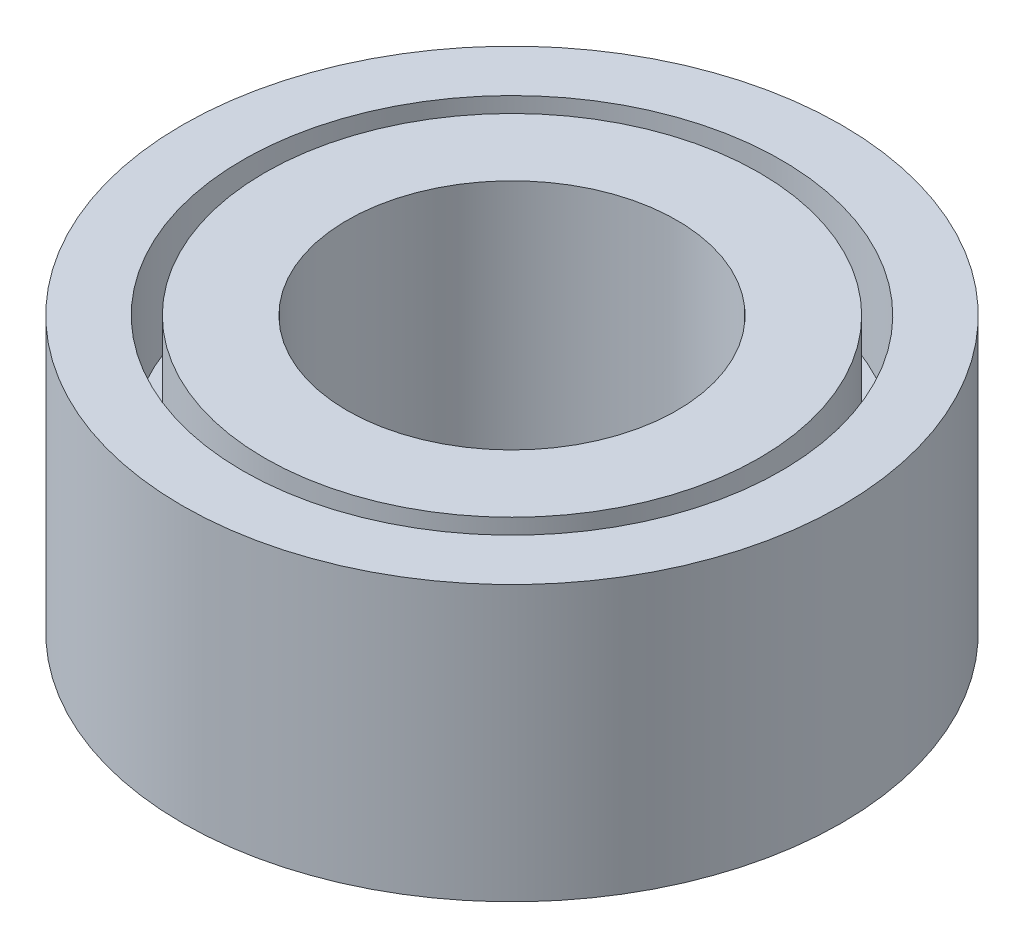
ISO-10303-21;
HEADER;
FILE_DESCRIPTION(('STEP AP214'),'2;1');
FILE_NAME('part.step','',(''),(''),'','','');
FILE_SCHEMA(('AUTOMOTIVE_DESIGN { 1 0 10303 214 1 1 1 1 }'));
ENDSEC;
DATA;
#1=APPLICATION_CONTEXT('core data for automotive mechanical design processes');
#2=APPLICATION_PROTOCOL_DEFINITION('international standard','automotive_design',2000,#1);
#3=PRODUCT_CONTEXT('',#1,'mechanical');
#4=PRODUCT('Part','Part','',(#3));
#5=PRODUCT_RELATED_PRODUCT_CATEGORY('part','',(#4));
#6=PRODUCT_DEFINITION_FORMATION('','',#4);
#7=PRODUCT_DEFINITION_CONTEXT('part definition',#1,'design');
#8=PRODUCT_DEFINITION('design','',#6,#7);
#9=PRODUCT_DEFINITION_SHAPE('','',#8);
#10=(LENGTH_UNIT() NAMED_UNIT(*) SI_UNIT(.MILLI.,.METRE.));
#11=(NAMED_UNIT(*) PLANE_ANGLE_UNIT() SI_UNIT($,.RADIAN.));
#12=(NAMED_UNIT(*) SI_UNIT($,.STERADIAN.) SOLID_ANGLE_UNIT());
#13=UNCERTAINTY_MEASURE_WITH_UNIT(LENGTH_MEASURE(1.E-05),#10,'distance_accuracy_value','');
#14=(GEOMETRIC_REPRESENTATION_CONTEXT(3) GLOBAL_UNCERTAINTY_ASSIGNED_CONTEXT((#13)) GLOBAL_UNIT_ASSIGNED_CONTEXT((#10,
#11,#12)) REPRESENTATION_CONTEXT('',''));
#15=CARTESIAN_POINT('',(0.,0.,0.));
#16=DIRECTION('',(0.,0.,1.));
#17=DIRECTION('',(1.,0.,0.));
#18=AXIS2_PLACEMENT_3D('',#15,#16,#17);
#19=CARTESIAN_POINT('',(0.,2.5,0.));
#20=DIRECTION('',(0.,1.,0.));
#21=DIRECTION('',(0.,0.,1.));
#22=AXIS2_PLACEMENT_3D('',#19,#20,#21);
#23=PLANE('',#22);
#24=CARTESIAN_POINT('',(0.,2.5,0.));
#25=DIRECTION('',(0.,1.,0.));
#26=DIRECTION('',(0.,0.,1.));
#27=AXIS2_PLACEMENT_3D('',#24,#25,#26);
#28=CIRCLE('',#27,1.5);
#29=CARTESIAN_POINT('',(0.,2.5,1.5));
#30=VERTEX_POINT('',#29);
#31=EDGE_CURVE('E68',#30,#30,#28,.T.);
#32=ORIENTED_EDGE('',*,*,#31,.F.);
#33=EDGE_LOOP('',(#32));
#34=FACE_BOUND('',#33,.T.);
#35=CARTESIAN_POINT('',(0.,2.5,0.));
#36=DIRECTION('',(0.,1.,0.));
#37=DIRECTION('',(0.,0.,1.));
#38=AXIS2_PLACEMENT_3D('',#35,#36,#37);
#39=CIRCLE('',#38,2.25);
#40=CARTESIAN_POINT('',(0.,2.5,2.25));
#41=VERTEX_POINT('',#40);
#42=EDGE_CURVE('E102',#41,#41,#39,.T.);
#43=ORIENTED_EDGE('',*,*,#42,.T.);
#44=EDGE_LOOP('',(#43));
#45=FACE_BOUND('',#44,.T.);
#46=ADVANCED_FACE('F55',(#34,#45),#23,.T.);
#47=CARTESIAN_POINT('',(0.,0.,0.));
#48=DIRECTION('',(0.,1.,0.));
#49=DIRECTION('',(0.,0.,1.));
#50=AXIS2_PLACEMENT_3D('',#47,#48,#49);
#51=PLANE('',#50);
#52=CARTESIAN_POINT('',(0.,0.,0.));
#53=DIRECTION('',(0.,1.,0.));
#54=DIRECTION('',(0.,0.,1.));
#55=AXIS2_PLACEMENT_3D('',#52,#53,#54);
#56=CIRCLE('',#55,1.5);
#57=CARTESIAN_POINT('',(0.,0.,1.5));
#58=VERTEX_POINT('',#57);
#59=EDGE_CURVE('E70',#58,#58,#56,.T.);
#60=ORIENTED_EDGE('',*,*,#59,.T.);
#61=EDGE_LOOP('',(#60));
#62=FACE_BOUND('',#61,.T.);
#63=CARTESIAN_POINT('',(0.,0.,0.));
#64=DIRECTION('',(0.,1.,0.));
#65=DIRECTION('',(0.,0.,1.));
#66=AXIS2_PLACEMENT_3D('',#63,#64,#65);
#67=CIRCLE('',#66,2.25);
#68=CARTESIAN_POINT('',(0.,0.,2.25));
#69=VERTEX_POINT('',#68);
#70=EDGE_CURVE('E86',#69,#69,#67,.T.);
#71=ORIENTED_EDGE('',*,*,#70,.F.);
#72=EDGE_LOOP('',(#71));
#73=FACE_BOUND('',#72,.T.);
#74=ADVANCED_FACE('F129',(#62,#73),#51,.F.);
#75=CARTESIAN_POINT('',(0.,2.5,0.));
#76=DIRECTION('',(0.,1.,0.));
#77=DIRECTION('',(0.,0.,1.));
#78=AXIS2_PLACEMENT_3D('',#75,#76,#77);
#79=CIRCLE('',#78,2.45);
#80=CARTESIAN_POINT('',(0.,2.5,2.45));
#81=VERTEX_POINT('',#80);
#82=EDGE_CURVE('E94',#81,#81,#79,.T.);
#83=ORIENTED_EDGE('',*,*,#82,.F.);
#84=EDGE_LOOP('',(#83));
#85=FACE_BOUND('',#84,.T.);
#86=CARTESIAN_POINT('',(0.,2.5,0.));
#87=DIRECTION('',(0.,1.,0.));
#88=DIRECTION('',(0.,0.,1.));
#89=AXIS2_PLACEMENT_3D('',#86,#87,#88);
#90=CIRCLE('',#89,3.);
#91=CARTESIAN_POINT('',(0.,2.5,3.));
#92=VERTEX_POINT('',#91);
#93=EDGE_CURVE('E11',#92,#92,#90,.T.);
#94=ORIENTED_EDGE('',*,*,#93,.T.);
#95=EDGE_LOOP('',(#94));
#96=FACE_BOUND('',#95,.T.);
#97=ADVANCED_FACE('F126',(#85,#96),#23,.T.);
#98=CARTESIAN_POINT('',(0.,0.,0.));
#99=DIRECTION('',(0.,1.,0.));
#100=DIRECTION('',(1.,0.,0.));
#101=AXIS2_PLACEMENT_3D('',#98,#99,#100);
#102=CIRCLE('',#101,2.45);
#103=CARTESIAN_POINT('',(2.45,0.,0.));
#104=VERTEX_POINT('',#103);
#105=EDGE_CURVE('E78',#104,#104,#102,.T.);
#106=ORIENTED_EDGE('',*,*,#105,.T.);
#107=EDGE_LOOP('',(#106));
#108=FACE_BOUND('',#107,.T.);
#109=CARTESIAN_POINT('',(0.,0.,0.));
#110=DIRECTION('',(0.,1.,0.));
#111=DIRECTION('',(0.,0.,1.));
#112=AXIS2_PLACEMENT_3D('',#109,#110,#111);
#113=CIRCLE('',#112,3.);
#114=CARTESIAN_POINT('',(0.,0.,3.));
#115=VERTEX_POINT('',#114);
#116=EDGE_CURVE('E59',#115,#115,#113,.T.);
#117=ORIENTED_EDGE('',*,*,#116,.F.);
#118=EDGE_LOOP('',(#117));
#119=FACE_BOUND('',#118,.T.);
#120=ADVANCED_FACE('F128',(#108,#119),#51,.F.);
#121=CARTESIAN_POINT('',(0.,2.5,0.));
#122=DIRECTION('',(0.,-1.,0.));
#123=DIRECTION('',(0.,0.,-1.));
#124=AXIS2_PLACEMENT_3D('',#121,#122,#123);
#125=CYLINDRICAL_SURFACE('',#124,3.);
#126=ORIENTED_EDGE('',*,*,#93,.F.);
#127=EDGE_LOOP('',(#126));
#128=FACE_BOUND('',#127,.T.);
#129=ORIENTED_EDGE('',*,*,#116,.T.);
#130=EDGE_LOOP('',(#129));
#131=FACE_BOUND('',#130,.T.);
#132=ADVANCED_FACE('F57',(#128,#131),#125,.T.);
#133=CARTESIAN_POINT('',(0.,2.5,0.));
#134=DIRECTION('',(0.,-1.,0.));
#135=DIRECTION('',(0.,0.,-1.));
#136=AXIS2_PLACEMENT_3D('',#133,#134,#135);
#137=CYLINDRICAL_SURFACE('',#136,1.5);
#138=ORIENTED_EDGE('',*,*,#31,.T.);
#139=EDGE_LOOP('',(#138));
#140=FACE_BOUND('',#139,.T.);
#141=ORIENTED_EDGE('',*,*,#59,.F.);
#142=EDGE_LOOP('',(#141));
#143=FACE_BOUND('',#142,.T.);
#144=ADVANCED_FACE('F157',(#140,#143),#137,.F.);
#145=CARTESIAN_POINT('',(0.,1.,0.));
#146=DIRECTION('',(0.,1.,0.));
#147=DIRECTION('',(0.,0.,1.));
#148=AXIS2_PLACEMENT_3D('',#145,#146,#147);
#149=PLANE('',#148);
#150=CARTESIAN_POINT('',(0.,1.,0.));
#151=DIRECTION('',(0.,1.,0.));
#152=DIRECTION('',(1.,0.,0.));
#153=AXIS2_PLACEMENT_3D('',#150,#151,#152);
#154=CIRCLE('',#153,2.45);
#155=CARTESIAN_POINT('',(2.45,1.,0.));
#156=VERTEX_POINT('',#155);
#157=EDGE_CURVE('E74',#156,#156,#154,.T.);
#158=ORIENTED_EDGE('',*,*,#157,.F.);
#159=EDGE_LOOP('',(#158));
#160=FACE_BOUND('',#159,.T.);
#161=CARTESIAN_POINT('',(0.,1.,0.));
#162=DIRECTION('',(0.,1.,0.));
#163=DIRECTION('',(0.,0.,1.));
#164=AXIS2_PLACEMENT_3D('',#161,#162,#163);
#165=CIRCLE('',#164,2.25);
#166=CARTESIAN_POINT('',(0.,1.,2.25));
#167=VERTEX_POINT('',#166);
#168=EDGE_CURVE('E82',#167,#167,#165,.T.);
#169=ORIENTED_EDGE('',*,*,#168,.T.);
#170=EDGE_LOOP('',(#169));
#171=FACE_BOUND('',#170,.T.);
#172=ADVANCED_FACE('F154',(#160,#171),#149,.F.);
#173=CARTESIAN_POINT('',(0.,1.,0.));
#174=DIRECTION('',(0.,-1.,0.));
#175=DIRECTION('',(0.,0.,-1.));
#176=AXIS2_PLACEMENT_3D('',#173,#174,#175);
#177=CYLINDRICAL_SURFACE('',#176,2.45);
#178=ORIENTED_EDGE('',*,*,#157,.T.);
#179=EDGE_LOOP('',(#178));
#180=FACE_BOUND('',#179,.T.);
#181=ORIENTED_EDGE('',*,*,#105,.F.);
#182=EDGE_LOOP('',(#181));
#183=FACE_BOUND('',#182,.T.);
#184=ADVANCED_FACE('F152',(#180,#183),#177,.F.);
#185=CARTESIAN_POINT('',(0.,1.,0.));
#186=DIRECTION('',(0.,-1.,0.));
#187=DIRECTION('',(0.,0.,-1.));
#188=AXIS2_PLACEMENT_3D('',#185,#186,#187);
#189=CYLINDRICAL_SURFACE('',#188,2.25);
#190=ORIENTED_EDGE('',*,*,#168,.F.);
#191=EDGE_LOOP('',(#190));
#192=FACE_BOUND('',#191,.T.);
#193=ORIENTED_EDGE('',*,*,#70,.T.);
#194=EDGE_LOOP('',(#193));
#195=FACE_BOUND('',#194,.T.);
#196=ADVANCED_FACE('F122',(#192,#195),#189,.T.);
#197=CARTESIAN_POINT('',(0.,1.5,0.));
#198=DIRECTION('',(0.,1.,0.));
#199=DIRECTION('',(0.,0.,1.));
#200=AXIS2_PLACEMENT_3D('',#197,#198,#199);
#201=CYLINDRICAL_SURFACE('',#200,2.45);
#202=CARTESIAN_POINT('',(0.,1.5,0.));
#203=DIRECTION('',(0.,1.,0.));
#204=DIRECTION('',(0.,0.,1.));
#205=AXIS2_PLACEMENT_3D('',#202,#203,#204);
#206=CIRCLE('',#205,2.45);
#207=CARTESIAN_POINT('',(0.,1.5,2.45));
#208=VERTEX_POINT('',#207);
#209=EDGE_CURVE('E90',#208,#208,#206,.T.);
#210=ORIENTED_EDGE('',*,*,#209,.F.);
#211=EDGE_LOOP('',(#210));
#212=FACE_BOUND('',#211,.T.);
#213=ORIENTED_EDGE('',*,*,#82,.T.);
#214=EDGE_LOOP('',(#213));
#215=FACE_BOUND('',#214,.T.);
#216=ADVANCED_FACE('F116',(#212,#215),#201,.F.);
#217=CARTESIAN_POINT('',(0.,1.5,0.));
#218=DIRECTION('',(0.,1.,0.));
#219=DIRECTION('',(0.,0.,1.));
#220=AXIS2_PLACEMENT_3D('',#217,#218,#219);
#221=PLANE('',#220);
#222=CARTESIAN_POINT('',(0.,1.5,0.));
#223=DIRECTION('',(0.,1.,0.));
#224=DIRECTION('',(0.,0.,1.));
#225=AXIS2_PLACEMENT_3D('',#222,#223,#224);
#226=CIRCLE('',#225,2.25);
#227=CARTESIAN_POINT('',(0.,1.5,2.25));
#228=VERTEX_POINT('',#227);
#229=EDGE_CURVE('E98',#228,#228,#226,.T.);
#230=ORIENTED_EDGE('',*,*,#229,.F.);
#231=EDGE_LOOP('',(#230));
#232=FACE_BOUND('',#231,.T.);
#233=ORIENTED_EDGE('',*,*,#209,.T.);
#234=EDGE_LOOP('',(#233));
#235=FACE_BOUND('',#234,.T.);
#236=ADVANCED_FACE('F113',(#232,#235),#221,.T.);
#237=CARTESIAN_POINT('',(0.,1.5,0.));
#238=DIRECTION('',(0.,1.,0.));
#239=DIRECTION('',(0.,0.,1.));
#240=AXIS2_PLACEMENT_3D('',#237,#238,#239);
#241=CYLINDRICAL_SURFACE('',#240,2.25);
#242=ORIENTED_EDGE('',*,*,#229,.T.);
#243=EDGE_LOOP('',(#242));
#244=FACE_BOUND('',#243,.T.);
#245=ORIENTED_EDGE('',*,*,#42,.F.);
#246=EDGE_LOOP('',(#245));
#247=FACE_BOUND('',#246,.T.);
#248=ADVANCED_FACE('F110',(#244,#247),#241,.T.);
#249=CLOSED_SHELL('',(#46,#74,#97,#120,#132,#144,#172,#184,#196,#216,#236,#248));
#250=MANIFOLD_SOLID_BREP('B2',#249);
#251=ADVANCED_BREP_SHAPE_REPRESENTATION('',(#18,#250),#14);
#252=SHAPE_DEFINITION_REPRESENTATION(#9,#251);
ENDSEC;
END-ISO-10303-21;
